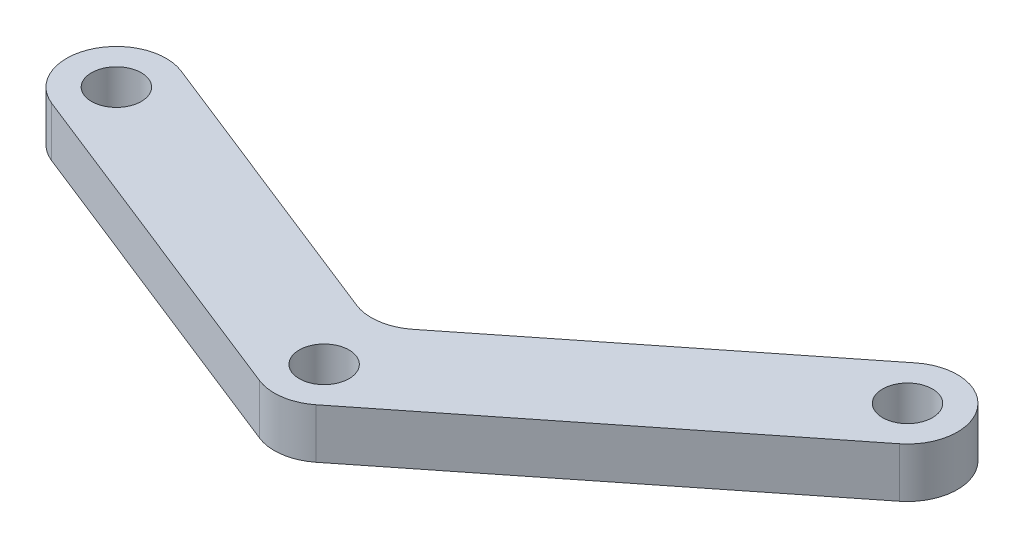
ISO-10303-21;
HEADER;
FILE_DESCRIPTION(('STEP AP214'),'2;1');
FILE_NAME('part.step','',(''),(''),'','','');
FILE_SCHEMA(('AUTOMOTIVE_DESIGN { 1 0 10303 214 1 1 1 1 }'));
ENDSEC;
DATA;
#1=APPLICATION_CONTEXT('core data for automotive mechanical design processes');
#2=APPLICATION_PROTOCOL_DEFINITION('international standard','automotive_design',2000,#1);
#3=PRODUCT_CONTEXT('',#1,'mechanical');
#4=PRODUCT('Part','Part','',(#3));
#5=PRODUCT_RELATED_PRODUCT_CATEGORY('part','',(#4));
#6=PRODUCT_DEFINITION_FORMATION('','',#4);
#7=PRODUCT_DEFINITION_CONTEXT('part definition',#1,'design');
#8=PRODUCT_DEFINITION('design','',#6,#7);
#9=PRODUCT_DEFINITION_SHAPE('','',#8);
#10=(LENGTH_UNIT() NAMED_UNIT(*) SI_UNIT(.MILLI.,.METRE.));
#11=(NAMED_UNIT(*) PLANE_ANGLE_UNIT() SI_UNIT($,.RADIAN.));
#12=(NAMED_UNIT(*) SI_UNIT($,.STERADIAN.) SOLID_ANGLE_UNIT());
#13=UNCERTAINTY_MEASURE_WITH_UNIT(LENGTH_MEASURE(1.E-05),#10,'distance_accuracy_value','');
#14=(GEOMETRIC_REPRESENTATION_CONTEXT(3) GLOBAL_UNCERTAINTY_ASSIGNED_CONTEXT((#13)) GLOBAL_UNIT_ASSIGNED_CONTEXT((#10,
#11,#12)) REPRESENTATION_CONTEXT('',''));
#15=CARTESIAN_POINT('',(0.,0.,0.));
#16=DIRECTION('',(0.,0.,1.));
#17=DIRECTION('',(1.,0.,0.));
#18=AXIS2_PLACEMENT_3D('',#15,#16,#17);
#19=CARTESIAN_POINT('',(-52.7065296715274,3.,-30.6999773757099));
#20=DIRECTION('',(0.,-1.,0.));
#21=DIRECTION('',(0.,0.,-1.));
#22=AXIS2_PLACEMENT_3D('',#19,#20,#21);
#23=PLANE('',#22);
#24=CARTESIAN_POINT('',(-52.7065296715274,3.,-30.6999773757099));
#25=DIRECTION('',(0.,1.,0.));
#26=DIRECTION('',(0.,0.,-1.));
#27=AXIS2_PLACEMENT_3D('',#24,#25,#26);
#28=CIRCLE('',#27,3.);
#29=CARTESIAN_POINT('',(-51.6019601116446,3.,-33.4892292623957));
#30=VERTEX_POINT('',#29);
#31=CARTESIAN_POINT('',(-53.8110992314102,3.,-27.9107254890241));
#32=VERTEX_POINT('',#31);
#33=EDGE_CURVE('E145',#30,#32,#28,.T.);
#34=ORIENTED_EDGE('',*,*,#33,.T.);
#35=DIRECTION('',(0.929750628895264,0.,0.368189853294276));
#36=VECTOR('',#35,1.);
#37=CARTESIAN_POINT('',(-33.1045695598828,3.,-19.7107481133142));
#38=LINE('',#37,#36);
#39=CARTESIAN_POINT('',(-33.1045695598828,3.,-19.7107481133142));
#40=VERTEX_POINT('',#39);
#41=EDGE_CURVE('E93',#32,#40,#38,.T.);
#42=ORIENTED_EDGE('',*,*,#41,.T.);
#43=CARTESIAN_POINT('',(-32.,3.,-22.5));
#44=DIRECTION('',(0.,1.,0.));
#45=DIRECTION('',(0.,0.,-1.));
#46=AXIS2_PLACEMENT_3D('',#43,#44,#45);
#47=CIRCLE('',#46,3.);
#48=CARTESIAN_POINT('',(-30.1367217885178,3.,-20.1487887575516));
#49=VERTEX_POINT('',#48);
#50=EDGE_CURVE('E160',#40,#49,#47,.T.);
#51=ORIENTED_EDGE('',*,*,#50,.T.);
#52=DIRECTION('',(0.78373708081614,0.,-0.62109273716072));
#53=VECTOR('',#52,1.);
#54=CARTESIAN_POINT('',(-10.543294768114,3.,-35.6761071865699));
#55=LINE('',#54,#53);
#56=CARTESIAN_POINT('',(-10.543294768114,3.,-35.6761071865699));
#57=VERTEX_POINT('',#56);
#58=EDGE_CURVE('E173',#49,#57,#55,.T.);
#59=ORIENTED_EDGE('',*,*,#58,.T.);
#60=CARTESIAN_POINT('',(-12.4065729795961,3.,-38.0273184290183));
#61=DIRECTION('',(0.,1.,0.));
#62=DIRECTION('',(0.,0.,1.));
#63=AXIS2_PLACEMENT_3D('',#60,#61,#62);
#64=CIRCLE('',#63,3.);
#65=CARTESIAN_POINT('',(-14.2698511910783,3.,-40.3785296714667));
#66=VERTEX_POINT('',#65);
#67=EDGE_CURVE('E112',#57,#66,#64,.T.);
#68=ORIENTED_EDGE('',*,*,#67,.T.);
#69=DIRECTION('',(-0.78373708081614,0.,0.62109273716072));
#70=VECTOR('',#69,1.);
#71=CARTESIAN_POINT('',(-14.2698511910783,3.,-40.3785296714667));
#72=LINE('',#71,#70);
#73=CARTESIAN_POINT('',(-31.1483333239836,3.,-27.0027395963972));
#74=VERTEX_POINT('',#73);
#75=EDGE_CURVE('E106',#66,#74,#72,.T.);
#76=ORIENTED_EDGE('',*,*,#75,.T.);
#77=CARTESIAN_POINT('',(-33.0116115354658,3.,-29.3539508388456));
#78=DIRECTION('',(0.,-1.,0.));
#79=DIRECTION('',(0.,0.,-1.));
#80=AXIS2_PLACEMENT_3D('',#77,#78,#79);
#81=CIRCLE('',#80,3.);
#82=CARTESIAN_POINT('',(-34.1161810953486,3.,-26.5646989521598));
#83=VERTEX_POINT('',#82);
#84=EDGE_CURVE('E110',#74,#83,#81,.T.);
#85=ORIENTED_EDGE('',*,*,#84,.T.);
#86=DIRECTION('',(-0.929750628895264,0.,-0.368189853294276));
#87=VECTOR('',#86,1.);
#88=CARTESIAN_POINT('',(-34.1161810953486,3.,-26.5646989521598));
#89=LINE('',#88,#87);
#90=EDGE_CURVE('E50',#83,#30,#89,.T.);
#91=ORIENTED_EDGE('',*,*,#90,.T.);
#92=EDGE_LOOP('',(#34,#42,#51,#59,#68,#76,#85,#91));
#93=FACE_BOUND('',#92,.T.);
#94=CARTESIAN_POINT('',(-32.,3.,-22.5));
#95=DIRECTION('',(0.,1.,0.));
#96=DIRECTION('',(0.,0.,1.));
#97=AXIS2_PLACEMENT_3D('',#94,#95,#96);
#98=CIRCLE('',#97,1.5);
#99=CARTESIAN_POINT('',(-32.,3.,-21.));
#100=VERTEX_POINT('',#99);
#101=EDGE_CURVE('E134',#100,#100,#98,.T.);
#102=ORIENTED_EDGE('',*,*,#101,.F.);
#103=EDGE_LOOP('',(#102));
#104=FACE_BOUND('',#103,.T.);
#105=CARTESIAN_POINT('',(-52.7065296715274,3.,-30.6999773757099));
#106=DIRECTION('',(0.,1.,0.));
#107=DIRECTION('',(0.,0.,1.));
#108=AXIS2_PLACEMENT_3D('',#105,#106,#107);
#109=CIRCLE('',#108,1.5);
#110=CARTESIAN_POINT('',(-52.7065296715274,3.,-29.1999773757099));
#111=VERTEX_POINT('',#110);
#112=EDGE_CURVE('E182',#111,#111,#109,.T.);
#113=ORIENTED_EDGE('',*,*,#112,.F.);
#114=EDGE_LOOP('',(#113));
#115=FACE_BOUND('',#114,.T.);
#116=CARTESIAN_POINT('',(-12.4065729795961,3.,-38.0273184290183));
#117=DIRECTION('',(0.,1.,0.));
#118=DIRECTION('',(0.,0.,1.));
#119=AXIS2_PLACEMENT_3D('',#116,#117,#118);
#120=CIRCLE('',#119,1.5);
#121=CARTESIAN_POINT('',(-12.4065729795961,3.,-36.5273184290183));
#122=VERTEX_POINT('',#121);
#123=EDGE_CURVE('E188',#122,#122,#120,.T.);
#124=ORIENTED_EDGE('',*,*,#123,.F.);
#125=EDGE_LOOP('',(#124));
#126=FACE_BOUND('',#125,.T.);
#127=ADVANCED_FACE('F33',(#93,#104,#115,#126),#23,.F.);
#128=CARTESIAN_POINT('',(-52.7065296715274,0.,-30.6999773757099));
#129=DIRECTION('',(0.,-1.,0.));
#130=DIRECTION('',(0.,0.,-1.));
#131=AXIS2_PLACEMENT_3D('',#128,#129,#130);
#132=PLANE('',#131);
#133=CARTESIAN_POINT('',(-52.7065296715274,0.,-30.6999773757099));
#134=DIRECTION('',(0.,1.,0.));
#135=DIRECTION('',(0.,0.,1.));
#136=AXIS2_PLACEMENT_3D('',#133,#134,#135);
#137=CIRCLE('',#136,1.5);
#138=CARTESIAN_POINT('',(-52.7065296715274,0.,-29.1999773757099));
#139=VERTEX_POINT('',#138);
#140=EDGE_CURVE('E185',#139,#139,#137,.T.);
#141=ORIENTED_EDGE('',*,*,#140,.T.);
#142=EDGE_LOOP('',(#141));
#143=FACE_BOUND('',#142,.T.);
#144=CARTESIAN_POINT('',(-52.7065296715274,0.,-30.6999773757099));
#145=DIRECTION('',(0.,1.,0.));
#146=DIRECTION('',(0.,0.,-1.));
#147=AXIS2_PLACEMENT_3D('',#144,#145,#146);
#148=CIRCLE('',#147,3.);
#149=CARTESIAN_POINT('',(-51.6019601116446,0.,-33.4892292623957));
#150=VERTEX_POINT('',#149);
#151=CARTESIAN_POINT('',(-53.8110992314102,0.,-27.9107254890241));
#152=VERTEX_POINT('',#151);
#153=EDGE_CURVE('E130',#150,#152,#148,.T.);
#154=ORIENTED_EDGE('',*,*,#153,.F.);
#155=DIRECTION('',(-0.929750628895264,0.,-0.368189853294276));
#156=VECTOR('',#155,1.);
#157=CARTESIAN_POINT('',(-34.1161810953486,0.,-26.5646989521598));
#158=LINE('',#157,#156);
#159=CARTESIAN_POINT('',(-34.1161810953486,0.,-26.5646989521598));
#160=VERTEX_POINT('',#159);
#161=EDGE_CURVE('E85',#160,#150,#158,.T.);
#162=ORIENTED_EDGE('',*,*,#161,.F.);
#163=CARTESIAN_POINT('',(-33.0116115354658,0.,-29.3539508388456));
#164=DIRECTION('',(0.,-1.,0.));
#165=DIRECTION('',(0.,0.,-1.));
#166=AXIS2_PLACEMENT_3D('',#163,#164,#165);
#167=CIRCLE('',#166,3.);
#168=CARTESIAN_POINT('',(-31.1483333239836,0.,-27.0027395963972));
#169=VERTEX_POINT('',#168);
#170=EDGE_CURVE('E79',#169,#160,#167,.T.);
#171=ORIENTED_EDGE('',*,*,#170,.F.);
#172=DIRECTION('',(-0.78373708081614,0.,0.62109273716072));
#173=VECTOR('',#172,1.);
#174=CARTESIAN_POINT('',(-14.2698511910783,0.,-40.3785296714667));
#175=LINE('',#174,#173);
#176=CARTESIAN_POINT('',(-14.2698511910783,0.,-40.3785296714667));
#177=VERTEX_POINT('',#176);
#178=EDGE_CURVE('E120',#177,#169,#175,.T.);
#179=ORIENTED_EDGE('',*,*,#178,.F.);
#180=CARTESIAN_POINT('',(-12.4065729795961,0.,-38.0273184290183));
#181=DIRECTION('',(0.,1.,0.));
#182=DIRECTION('',(0.,0.,1.));
#183=AXIS2_PLACEMENT_3D('',#180,#181,#182);
#184=CIRCLE('',#183,3.);
#185=CARTESIAN_POINT('',(-10.543294768114,0.,-35.6761071865699));
#186=VERTEX_POINT('',#185);
#187=EDGE_CURVE('E140',#186,#177,#184,.T.);
#188=ORIENTED_EDGE('',*,*,#187,.F.);
#189=DIRECTION('',(0.78373708081614,0.,-0.62109273716072));
#190=VECTOR('',#189,1.);
#191=CARTESIAN_POINT('',(-10.543294768114,0.,-35.6761071865699));
#192=LINE('',#191,#190);
#193=CARTESIAN_POINT('',(-30.1367217885178,0.,-20.1487887575516));
#194=VERTEX_POINT('',#193);
#195=EDGE_CURVE('E138',#194,#186,#192,.T.);
#196=ORIENTED_EDGE('',*,*,#195,.F.);
#197=CARTESIAN_POINT('',(-32.,0.,-22.5));
#198=DIRECTION('',(0.,1.,0.));
#199=DIRECTION('',(0.,0.,-1.));
#200=AXIS2_PLACEMENT_3D('',#197,#198,#199);
#201=CIRCLE('',#200,3.);
#202=CARTESIAN_POINT('',(-33.1045695598828,0.,-19.7107481133142));
#203=VERTEX_POINT('',#202);
#204=EDGE_CURVE('E136',#203,#194,#201,.T.);
#205=ORIENTED_EDGE('',*,*,#204,.F.);
#206=DIRECTION('',(0.929750628895264,0.,0.368189853294276));
#207=VECTOR('',#206,1.);
#208=CARTESIAN_POINT('',(-33.1045695598828,0.,-19.7107481133142));
#209=LINE('',#208,#207);
#210=EDGE_CURVE('E133',#152,#203,#209,.T.);
#211=ORIENTED_EDGE('',*,*,#210,.F.);
#212=EDGE_LOOP('',(#154,#162,#171,#179,#188,#196,#205,#211));
#213=FACE_BOUND('',#212,.T.);
#214=CARTESIAN_POINT('',(-32.,0.,-22.5));
#215=DIRECTION('',(0.,1.,0.));
#216=DIRECTION('',(0.,0.,1.));
#217=AXIS2_PLACEMENT_3D('',#214,#215,#216);
#218=CIRCLE('',#217,1.5);
#219=CARTESIAN_POINT('',(-32.,0.,-21.));
#220=VERTEX_POINT('',#219);
#221=EDGE_CURVE('E179',#220,#220,#218,.T.);
#222=ORIENTED_EDGE('',*,*,#221,.T.);
#223=EDGE_LOOP('',(#222));
#224=FACE_BOUND('',#223,.T.);
#225=CARTESIAN_POINT('',(-12.4065729795961,0.,-38.0273184290183));
#226=DIRECTION('',(0.,1.,0.));
#227=DIRECTION('',(0.,0.,1.));
#228=AXIS2_PLACEMENT_3D('',#225,#226,#227);
#229=CIRCLE('',#228,1.5);
#230=CARTESIAN_POINT('',(-12.4065729795961,0.,-36.5273184290183));
#231=VERTEX_POINT('',#230);
#232=EDGE_CURVE('E191',#231,#231,#229,.T.);
#233=ORIENTED_EDGE('',*,*,#232,.T.);
#234=EDGE_LOOP('',(#233));
#235=FACE_BOUND('',#234,.T.);
#236=ADVANCED_FACE('F164',(#143,#213,#224,#235),#132,.T.);
#237=CARTESIAN_POINT('',(-52.7065296715274,3.,-30.6999773757099));
#238=DIRECTION('',(0.,-1.,0.));
#239=DIRECTION('',(0.,0.,-1.));
#240=AXIS2_PLACEMENT_3D('',#237,#238,#239);
#241=CYLINDRICAL_SURFACE('',#240,3.);
#242=ORIENTED_EDGE('',*,*,#153,.T.);
#243=DIRECTION('',(0.,-1.,0.));
#244=VECTOR('',#243,1.);
#245=CARTESIAN_POINT('',(-53.8110992314102,3.,-27.9107254890241));
#246=LINE('',#245,#244);
#247=EDGE_CURVE('E11',#32,#152,#246,.T.);
#248=ORIENTED_EDGE('',*,*,#247,.F.);
#249=ORIENTED_EDGE('',*,*,#33,.F.);
#250=DIRECTION('',(0.,-1.,0.));
#251=VECTOR('',#250,1.);
#252=CARTESIAN_POINT('',(-51.6019601116446,3.,-33.4892292623957));
#253=LINE('',#252,#251);
#254=EDGE_CURVE('E126',#30,#150,#253,.T.);
#255=ORIENTED_EDGE('',*,*,#254,.T.);
#256=EDGE_LOOP('',(#242,#248,#249,#255));
#257=FACE_BOUND('',#256,.T.);
#258=ADVANCED_FACE('F35',(#257),#241,.T.);
#259=CARTESIAN_POINT('',(-33.1045695598828,3.,-19.7107481133142));
#260=DIRECTION('',(0.368189853294276,0.,-0.929750628895264));
#261=DIRECTION('',(-0.929750628895264,0.,-0.368189853294276));
#262=AXIS2_PLACEMENT_3D('',#259,#260,#261);
#263=PLANE('',#262);
#264=ORIENTED_EDGE('',*,*,#210,.T.);
#265=DIRECTION('',(0.,-1.,0.));
#266=VECTOR('',#265,1.);
#267=CARTESIAN_POINT('',(-33.1045695598828,3.,-19.7107481133142));
#268=LINE('',#267,#266);
#269=EDGE_CURVE('E42',#40,#203,#268,.T.);
#270=ORIENTED_EDGE('',*,*,#269,.F.);
#271=ORIENTED_EDGE('',*,*,#41,.F.);
#272=ORIENTED_EDGE('',*,*,#247,.T.);
#273=EDGE_LOOP('',(#264,#270,#271,#272));
#274=FACE_BOUND('',#273,.T.);
#275=ADVANCED_FACE('F223',(#274),#263,.F.);
#276=CARTESIAN_POINT('',(-32.,3.,-22.5));
#277=DIRECTION('',(0.,-1.,0.));
#278=DIRECTION('',(0.,0.,-1.));
#279=AXIS2_PLACEMENT_3D('',#276,#277,#278);
#280=CYLINDRICAL_SURFACE('',#279,3.);
#281=ORIENTED_EDGE('',*,*,#204,.T.);
#282=DIRECTION('',(0.,-1.,0.));
#283=VECTOR('',#282,1.);
#284=CARTESIAN_POINT('',(-30.1367217885178,3.,-20.1487887575516));
#285=LINE('',#284,#283);
#286=EDGE_CURVE('E152',#49,#194,#285,.T.);
#287=ORIENTED_EDGE('',*,*,#286,.F.);
#288=ORIENTED_EDGE('',*,*,#50,.F.);
#289=ORIENTED_EDGE('',*,*,#269,.T.);
#290=EDGE_LOOP('',(#281,#287,#288,#289));
#291=FACE_BOUND('',#290,.T.);
#292=ADVANCED_FACE('F158',(#291),#280,.T.);
#293=CARTESIAN_POINT('',(-10.543294768114,3.,-35.6761071865699));
#294=DIRECTION('',(-0.62109273716072,0.,-0.78373708081614));
#295=DIRECTION('',(-0.78373708081614,0.,0.62109273716072));
#296=AXIS2_PLACEMENT_3D('',#293,#294,#295);
#297=PLANE('',#296);
#298=ORIENTED_EDGE('',*,*,#195,.T.);
#299=DIRECTION('',(0.,-1.,0.));
#300=VECTOR('',#299,1.);
#301=CARTESIAN_POINT('',(-10.543294768114,3.,-35.6761071865699));
#302=LINE('',#301,#300);
#303=EDGE_CURVE('E149',#57,#186,#302,.T.);
#304=ORIENTED_EDGE('',*,*,#303,.F.);
#305=ORIENTED_EDGE('',*,*,#58,.F.);
#306=ORIENTED_EDGE('',*,*,#286,.T.);
#307=EDGE_LOOP('',(#298,#304,#305,#306));
#308=FACE_BOUND('',#307,.T.);
#309=ADVANCED_FACE('F169',(#308),#297,.F.);
#310=CARTESIAN_POINT('',(-12.4065729795961,3.,-38.0273184290183));
#311=DIRECTION('',(0.,-1.,0.));
#312=DIRECTION('',(0.,0.,-1.));
#313=AXIS2_PLACEMENT_3D('',#310,#311,#312);
#314=CYLINDRICAL_SURFACE('',#313,3.);
#315=ORIENTED_EDGE('',*,*,#187,.T.);
#316=DIRECTION('',(0.,-1.,0.));
#317=VECTOR('',#316,1.);
#318=CARTESIAN_POINT('',(-14.2698511910783,3.,-40.3785296714667));
#319=LINE('',#318,#317);
#320=EDGE_CURVE('E121',#66,#177,#319,.T.);
#321=ORIENTED_EDGE('',*,*,#320,.F.);
#322=ORIENTED_EDGE('',*,*,#67,.F.);
#323=ORIENTED_EDGE('',*,*,#303,.T.);
#324=EDGE_LOOP('',(#315,#321,#322,#323));
#325=FACE_BOUND('',#324,.T.);
#326=ADVANCED_FACE('F172',(#325),#314,.T.);
#327=CARTESIAN_POINT('',(-14.2698511910783,3.,-40.3785296714667));
#328=DIRECTION('',(0.62109273716072,0.,0.78373708081614));
#329=DIRECTION('',(0.78373708081614,0.,-0.62109273716072));
#330=AXIS2_PLACEMENT_3D('',#327,#328,#329);
#331=PLANE('',#330);
#332=ORIENTED_EDGE('',*,*,#178,.T.);
#333=DIRECTION('',(0.,-1.,0.));
#334=VECTOR('',#333,1.);
#335=CARTESIAN_POINT('',(-31.1483333239836,3.,-27.0027395963972));
#336=LINE('',#335,#334);
#337=EDGE_CURVE('E117',#74,#169,#336,.T.);
#338=ORIENTED_EDGE('',*,*,#337,.F.);
#339=ORIENTED_EDGE('',*,*,#75,.F.);
#340=ORIENTED_EDGE('',*,*,#320,.T.);
#341=EDGE_LOOP('',(#332,#338,#339,#340));
#342=FACE_BOUND('',#341,.T.);
#343=ADVANCED_FACE('F118',(#342),#331,.F.);
#344=CARTESIAN_POINT('',(-33.0116115354658,3.,-29.3539508388456));
#345=DIRECTION('',(0.,-1.,0.));
#346=DIRECTION('',(0.,0.,-1.));
#347=AXIS2_PLACEMENT_3D('',#344,#345,#346);
#348=CYLINDRICAL_SURFACE('',#347,3.);
#349=ORIENTED_EDGE('',*,*,#170,.T.);
#350=DIRECTION('',(0.,-1.,0.));
#351=VECTOR('',#350,1.);
#352=CARTESIAN_POINT('',(-34.1161810953486,3.,-26.5646989521598));
#353=LINE('',#352,#351);
#354=EDGE_CURVE('E122',#83,#160,#353,.T.);
#355=ORIENTED_EDGE('',*,*,#354,.F.);
#356=ORIENTED_EDGE('',*,*,#84,.F.);
#357=ORIENTED_EDGE('',*,*,#337,.T.);
#358=EDGE_LOOP('',(#349,#355,#356,#357));
#359=FACE_BOUND('',#358,.T.);
#360=ADVANCED_FACE('F124',(#359),#348,.F.);
#361=CARTESIAN_POINT('',(-34.1161810953486,3.,-26.5646989521598));
#362=DIRECTION('',(-0.368189853294276,0.,0.929750628895264));
#363=DIRECTION('',(0.929750628895264,0.,0.368189853294276));
#364=AXIS2_PLACEMENT_3D('',#361,#362,#363);
#365=PLANE('',#364);
#366=ORIENTED_EDGE('',*,*,#161,.T.);
#367=ORIENTED_EDGE('',*,*,#254,.F.);
#368=ORIENTED_EDGE('',*,*,#90,.F.);
#369=ORIENTED_EDGE('',*,*,#354,.T.);
#370=EDGE_LOOP('',(#366,#367,#368,#369));
#371=FACE_BOUND('',#370,.T.);
#372=ADVANCED_FACE('F211',(#371),#365,.F.);
#373=CARTESIAN_POINT('',(-32.,3.,-22.5));
#374=DIRECTION('',(0.,-1.,0.));
#375=DIRECTION('',(0.,0.,-1.));
#376=AXIS2_PLACEMENT_3D('',#373,#374,#375);
#377=CYLINDRICAL_SURFACE('',#376,1.5);
#378=ORIENTED_EDGE('',*,*,#101,.T.);
#379=EDGE_LOOP('',(#378));
#380=FACE_BOUND('',#379,.T.);
#381=ORIENTED_EDGE('',*,*,#221,.F.);
#382=EDGE_LOOP('',(#381));
#383=FACE_BOUND('',#382,.T.);
#384=ADVANCED_FACE('F208',(#380,#383),#377,.F.);
#385=CARTESIAN_POINT('',(-52.7065296715274,3.,-30.6999773757099));
#386=DIRECTION('',(0.,-1.,0.));
#387=DIRECTION('',(0.,0.,-1.));
#388=AXIS2_PLACEMENT_3D('',#385,#386,#387);
#389=CYLINDRICAL_SURFACE('',#388,1.5);
#390=ORIENTED_EDGE('',*,*,#112,.T.);
#391=EDGE_LOOP('',(#390));
#392=FACE_BOUND('',#391,.T.);
#393=ORIENTED_EDGE('',*,*,#140,.F.);
#394=EDGE_LOOP('',(#393));
#395=FACE_BOUND('',#394,.T.);
#396=ADVANCED_FACE('F287',(#392,#395),#389,.F.);
#397=CARTESIAN_POINT('',(-12.4065729795961,3.,-38.0273184290183));
#398=DIRECTION('',(0.,-1.,0.));
#399=DIRECTION('',(0.,0.,-1.));
#400=AXIS2_PLACEMENT_3D('',#397,#398,#399);
#401=CYLINDRICAL_SURFACE('',#400,1.5);
#402=ORIENTED_EDGE('',*,*,#123,.T.);
#403=EDGE_LOOP('',(#402));
#404=FACE_BOUND('',#403,.T.);
#405=ORIENTED_EDGE('',*,*,#232,.F.);
#406=EDGE_LOOP('',(#405));
#407=FACE_BOUND('',#406,.T.);
#408=ADVANCED_FACE('F197',(#404,#407),#401,.F.);
#409=CLOSED_SHELL('',(#127,#236,#258,#275,#292,#309,#326,#343,#360,#372,#384,#396,#408));
#410=MANIFOLD_SOLID_BREP('B2',#409);
#411=ADVANCED_BREP_SHAPE_REPRESENTATION('',(#18,#410),#14);
#412=SHAPE_DEFINITION_REPRESENTATION(#9,#411);
ENDSEC;
END-ISO-10303-21;
